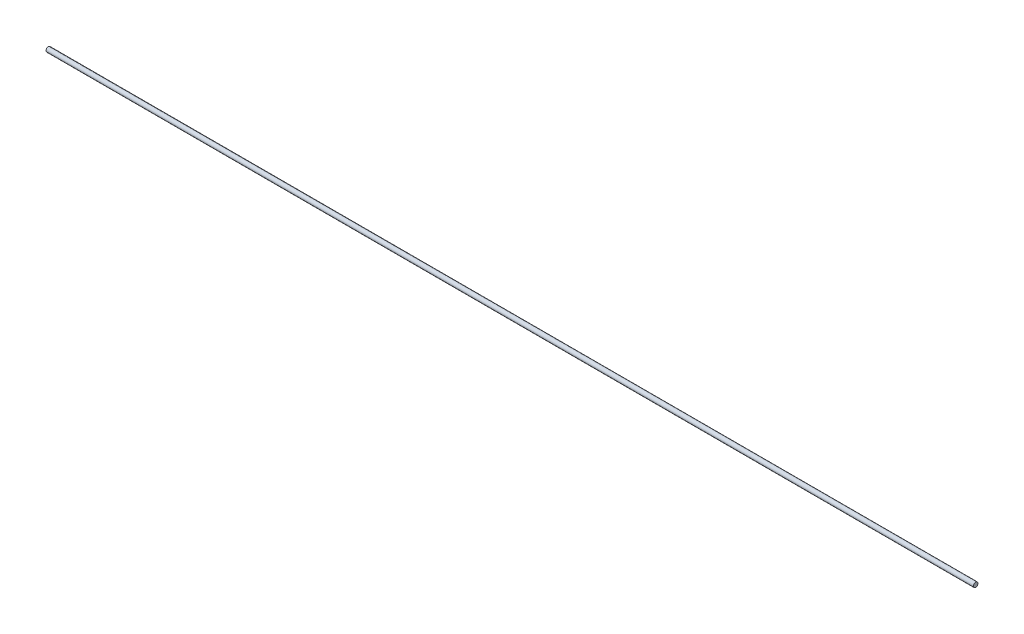
ISO-10303-21;
HEADER;
FILE_DESCRIPTION(('STEP AP214'),'2;1');
FILE_NAME('part.step','',(''),(''),'','','');
FILE_SCHEMA(('AUTOMOTIVE_DESIGN { 1 0 10303 214 1 1 1 1 }'));
ENDSEC;
DATA;
#1=APPLICATION_CONTEXT('core data for automotive mechanical design processes');
#2=APPLICATION_PROTOCOL_DEFINITION('international standard','automotive_design',2000,#1);
#3=PRODUCT_CONTEXT('',#1,'mechanical');
#4=PRODUCT('Part','Part','',(#3));
#5=PRODUCT_RELATED_PRODUCT_CATEGORY('part','',(#4));
#6=PRODUCT_DEFINITION_FORMATION('','',#4);
#7=PRODUCT_DEFINITION_CONTEXT('part definition',#1,'design');
#8=PRODUCT_DEFINITION('design','',#6,#7);
#9=PRODUCT_DEFINITION_SHAPE('','',#8);
#10=(LENGTH_UNIT() NAMED_UNIT(*) SI_UNIT(.MILLI.,.METRE.));
#11=(NAMED_UNIT(*) PLANE_ANGLE_UNIT() SI_UNIT($,.RADIAN.));
#12=(NAMED_UNIT(*) SI_UNIT($,.STERADIAN.) SOLID_ANGLE_UNIT());
#13=UNCERTAINTY_MEASURE_WITH_UNIT(LENGTH_MEASURE(1.E-05),#10,'distance_accuracy_value','');
#14=(GEOMETRIC_REPRESENTATION_CONTEXT(3) GLOBAL_UNCERTAINTY_ASSIGNED_CONTEXT((#13)) GLOBAL_UNIT_ASSIGNED_CONTEXT((#10,
#11,#12)) REPRESENTATION_CONTEXT('',''));
#15=CARTESIAN_POINT('',(0.,0.,0.));
#16=DIRECTION('',(0.,0.,1.));
#17=DIRECTION('',(1.,0.,0.));
#18=AXIS2_PLACEMENT_3D('',#15,#16,#17);
#19=CARTESIAN_POINT('',(50.,0.,0.));
#20=DIRECTION('',(-1.,0.,0.));
#21=DIRECTION('',(0.,0.,1.));
#22=AXIS2_PLACEMENT_3D('',#19,#20,#21);
#23=CYLINDRICAL_SURFACE('',#22,0.125);
#24=CARTESIAN_POINT('',(50.,0.,0.));
#25=DIRECTION('',(1.,0.,0.));
#26=DIRECTION('',(0.,0.,-1.));
#27=AXIS2_PLACEMENT_3D('',#24,#25,#26);
#28=CIRCLE('',#27,0.125);
#29=CARTESIAN_POINT('',(50.,0.,-0.125));
#30=VERTEX_POINT('',#29);
#31=EDGE_CURVE('E10',#30,#30,#28,.T.);
#32=ORIENTED_EDGE('',*,*,#31,.F.);
#33=EDGE_LOOP('',(#32));
#34=FACE_BOUND('',#33,.T.);
#35=CARTESIAN_POINT('',(0.,0.,0.));
#36=DIRECTION('',(1.,0.,0.));
#37=DIRECTION('',(0.,0.,-1.));
#38=AXIS2_PLACEMENT_3D('',#35,#36,#37);
#39=CIRCLE('',#38,0.125);
#40=CARTESIAN_POINT('',(0.,0.,-0.125));
#41=VERTEX_POINT('',#40);
#42=EDGE_CURVE('E40',#41,#41,#39,.T.);
#43=ORIENTED_EDGE('',*,*,#42,.T.);
#44=EDGE_LOOP('',(#43));
#45=FACE_BOUND('',#44,.T.);
#46=ADVANCED_FACE('F37',(#34,#45),#23,.T.);
#47=CARTESIAN_POINT('',(50.,0.,0.));
#48=DIRECTION('',(1.,0.,0.));
#49=DIRECTION('',(0.,0.,-1.));
#50=AXIS2_PLACEMENT_3D('',#47,#48,#49);
#51=PLANE('',#50);
#52=ORIENTED_EDGE('',*,*,#31,.T.);
#53=EDGE_LOOP('',(#52));
#54=FACE_BOUND('',#53,.T.);
#55=ADVANCED_FACE('F54',(#54),#51,.T.);
#56=CARTESIAN_POINT('',(0.,0.,0.));
#57=DIRECTION('',(1.,0.,0.));
#58=DIRECTION('',(0.,0.,-1.));
#59=AXIS2_PLACEMENT_3D('',#56,#57,#58);
#60=PLANE('',#59);
#61=ORIENTED_EDGE('',*,*,#42,.F.);
#62=EDGE_LOOP('',(#61));
#63=FACE_BOUND('',#62,.T.);
#64=ADVANCED_FACE('F52',(#63),#60,.F.);
#65=CLOSED_SHELL('',(#46,#55,#64));
#66=MANIFOLD_SOLID_BREP('B2',#65);
#67=ADVANCED_BREP_SHAPE_REPRESENTATION('',(#18,#66),#14);
#68=SHAPE_DEFINITION_REPRESENTATION(#9,#67);
ENDSEC;
END-ISO-10303-21;
